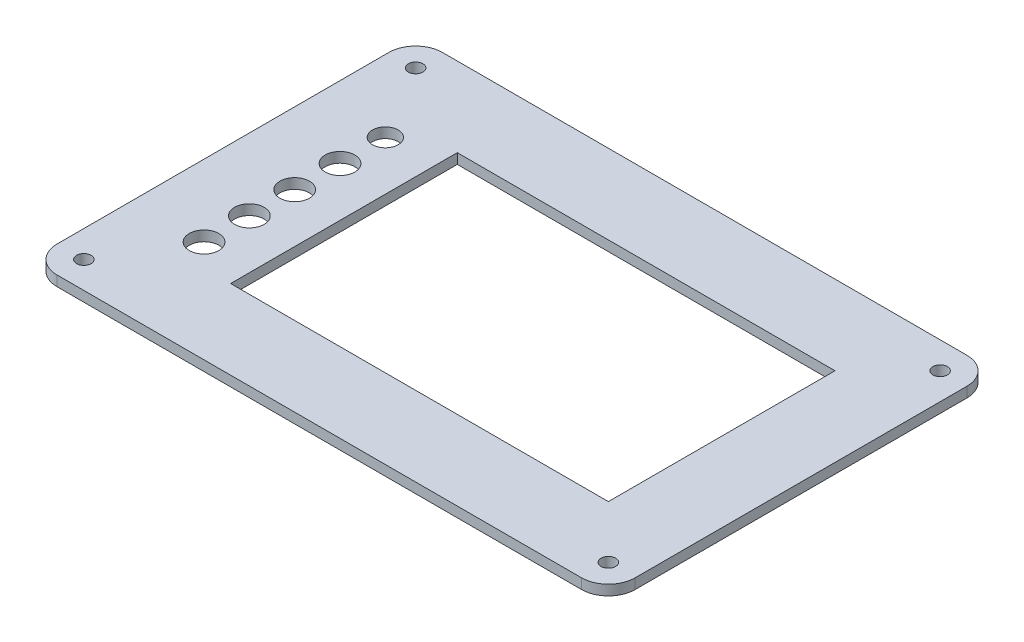
ISO-10303-21;
HEADER;
FILE_DESCRIPTION(('STEP AP214'),'2;1');
FILE_NAME('part.step','',(''),(''),'','','');
FILE_SCHEMA(('AUTOMOTIVE_DESIGN { 1 0 10303 214 1 1 1 1 }'));
ENDSEC;
DATA;
#1=APPLICATION_CONTEXT('core data for automotive mechanical design processes');
#2=APPLICATION_PROTOCOL_DEFINITION('international standard','automotive_design',2000,#1);
#3=PRODUCT_CONTEXT('',#1,'mechanical');
#4=PRODUCT('Part','Part','',(#3));
#5=PRODUCT_RELATED_PRODUCT_CATEGORY('part','',(#4));
#6=PRODUCT_DEFINITION_FORMATION('','',#4);
#7=PRODUCT_DEFINITION_CONTEXT('part definition',#1,'design');
#8=PRODUCT_DEFINITION('design','',#6,#7);
#9=PRODUCT_DEFINITION_SHAPE('','',#8);
#10=(LENGTH_UNIT() NAMED_UNIT(*) SI_UNIT(.MILLI.,.METRE.));
#11=(NAMED_UNIT(*) PLANE_ANGLE_UNIT() SI_UNIT($,.RADIAN.));
#12=(NAMED_UNIT(*) SI_UNIT($,.STERADIAN.) SOLID_ANGLE_UNIT());
#13=UNCERTAINTY_MEASURE_WITH_UNIT(LENGTH_MEASURE(1.E-05),#10,'distance_accuracy_value','');
#14=(GEOMETRIC_REPRESENTATION_CONTEXT(3) GLOBAL_UNCERTAINTY_ASSIGNED_CONTEXT((#13)) GLOBAL_UNIT_ASSIGNED_CONTEXT((#10,
#11,#12)) REPRESENTATION_CONTEXT('',''));
#15=CARTESIAN_POINT('',(0.,0.,0.));
#16=DIRECTION('',(0.,0.,1.));
#17=DIRECTION('',(1.,0.,0.));
#18=AXIS2_PLACEMENT_3D('',#15,#16,#17);
#19=CARTESIAN_POINT('',(-40.825,1.5875,-25.825));
#20=DIRECTION('',(0.,1.,0.));
#21=DIRECTION('',(0.,0.,1.));
#22=AXIS2_PLACEMENT_3D('',#19,#20,#21);
#23=PLANE('',#22);
#24=DIRECTION('',(0.,0.,-1.));
#25=VECTOR('',#24,1.);
#26=CARTESIAN_POINT('',(32.64,1.5875,-17.64));
#27=LINE('',#26,#25);
#28=CARTESIAN_POINT('',(32.64,1.5875,17.64));
#29=VERTEX_POINT('',#28);
#30=CARTESIAN_POINT('',(32.64,1.5875,-17.64));
#31=VERTEX_POINT('',#30);
#32=EDGE_CURVE('E56',#29,#31,#27,.T.);
#33=ORIENTED_EDGE('',*,*,#32,.F.);
#34=DIRECTION('',(1.,0.,0.));
#35=VECTOR('',#34,1.);
#36=CARTESIAN_POINT('',(-26.16,1.5875,17.64));
#37=LINE('',#36,#35);
#38=CARTESIAN_POINT('',(-26.16,1.5875,17.64));
#39=VERTEX_POINT('',#38);
#40=EDGE_CURVE('E148',#39,#29,#37,.T.);
#41=ORIENTED_EDGE('',*,*,#40,.F.);
#42=DIRECTION('',(0.,0.,1.));
#43=VECTOR('',#42,1.);
#44=CARTESIAN_POINT('',(-26.16,1.5875,-17.64));
#45=LINE('',#44,#43);
#46=CARTESIAN_POINT('',(-26.16,1.5875,-17.64));
#47=VERTEX_POINT('',#46);
#48=EDGE_CURVE('E152',#47,#39,#45,.T.);
#49=ORIENTED_EDGE('',*,*,#48,.F.);
#50=DIRECTION('',(-1.,0.,0.));
#51=VECTOR('',#50,1.);
#52=CARTESIAN_POINT('',(-26.16,1.5875,-17.64));
#53=LINE('',#52,#51);
#54=EDGE_CURVE('E192',#31,#47,#53,.T.);
#55=ORIENTED_EDGE('',*,*,#54,.F.);
#56=EDGE_LOOP('',(#33,#41,#49,#55));
#57=FACE_BOUND('',#56,.T.);
#58=CARTESIAN_POINT('',(-33.8249999999999,1.5875,14.115));
#59=DIRECTION('',(0.,1.,0.));
#60=DIRECTION('',(0.,0.,1.));
#61=AXIS2_PLACEMENT_3D('',#58,#59,#60);
#62=CIRCLE('',#61,2.30000000000001);
#63=CARTESIAN_POINT('',(-33.8249999999999,1.5875,16.415));
#64=VERTEX_POINT('',#63);
#65=EDGE_CURVE('E319',#64,#64,#62,.T.);
#66=ORIENTED_EDGE('',*,*,#65,.F.);
#67=EDGE_LOOP('',(#66));
#68=FACE_BOUND('',#67,.T.);
#69=CARTESIAN_POINT('',(-33.825,1.5875,7.059));
#70=DIRECTION('',(0.,1.,0.));
#71=DIRECTION('',(0.,0.,1.));
#72=AXIS2_PLACEMENT_3D('',#69,#70,#71);
#73=CIRCLE('',#72,2.30000000000001);
#74=CARTESIAN_POINT('',(-33.825,1.5875,9.35900000000001));
#75=VERTEX_POINT('',#74);
#76=EDGE_CURVE('E313',#75,#75,#73,.T.);
#77=ORIENTED_EDGE('',*,*,#76,.F.);
#78=EDGE_LOOP('',(#77));
#79=FACE_BOUND('',#78,.T.);
#80=CARTESIAN_POINT('',(-33.825,1.5875,0.00300000000000213));
#81=DIRECTION('',(0.,1.,0.));
#82=DIRECTION('',(0.,0.,1.));
#83=AXIS2_PLACEMENT_3D('',#80,#81,#82);
#84=CIRCLE('',#83,2.3);
#85=CARTESIAN_POINT('',(-33.825,1.5875,2.303));
#86=VERTEX_POINT('',#85);
#87=EDGE_CURVE('E307',#86,#86,#84,.T.);
#88=ORIENTED_EDGE('',*,*,#87,.F.);
#89=EDGE_LOOP('',(#88));
#90=FACE_BOUND('',#89,.T.);
#91=CARTESIAN_POINT('',(-33.825,1.5875,-7.053));
#92=DIRECTION('',(0.,1.,0.));
#93=DIRECTION('',(0.,0.,1.));
#94=AXIS2_PLACEMENT_3D('',#91,#92,#93);
#95=CIRCLE('',#94,2.3);
#96=CARTESIAN_POINT('',(-33.825,1.5875,-4.753));
#97=VERTEX_POINT('',#96);
#98=EDGE_CURVE('E301',#97,#97,#95,.T.);
#99=ORIENTED_EDGE('',*,*,#98,.F.);
#100=EDGE_LOOP('',(#99));
#101=FACE_BOUND('',#100,.T.);
#102=CARTESIAN_POINT('',(-33.825,1.5875,-14.109));
#103=DIRECTION('',(0.,1.,0.));
#104=DIRECTION('',(0.,0.,1.));
#105=AXIS2_PLACEMENT_3D('',#102,#103,#104);
#106=CIRCLE('',#105,1.9986);
#107=CARTESIAN_POINT('',(-33.825,1.5875,-12.1104));
#108=VERTEX_POINT('',#107);
#109=EDGE_CURVE('E295',#108,#108,#106,.T.);
#110=ORIENTED_EDGE('',*,*,#109,.F.);
#111=EDGE_LOOP('',(#110));
#112=FACE_BOUND('',#111,.T.);
#113=CARTESIAN_POINT('',(-40.825,1.5875,-25.825));
#114=DIRECTION('',(0.,1.,0.));
#115=DIRECTION('',(0.,0.,1.));
#116=AXIS2_PLACEMENT_3D('',#113,#114,#115);
#117=CIRCLE('',#116,1.1303);
#118=CARTESIAN_POINT('',(-40.825,1.5875,-24.6947));
#119=VERTEX_POINT('',#118);
#120=EDGE_CURVE('E277',#119,#119,#117,.T.);
#121=ORIENTED_EDGE('',*,*,#120,.F.);
#122=EDGE_LOOP('',(#121));
#123=FACE_BOUND('',#122,.T.);
#124=CARTESIAN_POINT('',(40.825,1.5875,-25.825));
#125=DIRECTION('',(0.,1.,0.));
#126=DIRECTION('',(0.,0.,1.));
#127=AXIS2_PLACEMENT_3D('',#124,#125,#126);
#128=CIRCLE('',#127,1.1303);
#129=CARTESIAN_POINT('',(40.825,1.5875,-24.6947));
#130=VERTEX_POINT('',#129);
#131=EDGE_CURVE('E269',#130,#130,#128,.T.);
#132=ORIENTED_EDGE('',*,*,#131,.F.);
#133=EDGE_LOOP('',(#132));
#134=FACE_BOUND('',#133,.T.);
#135=CARTESIAN_POINT('',(-40.825,1.5875,-25.825));
#136=DIRECTION('',(0.,1.,0.));
#137=DIRECTION('',(0.,0.,1.));
#138=AXIS2_PLACEMENT_3D('',#135,#136,#137);
#139=CIRCLE('',#138,4.17499999999999);
#140=CARTESIAN_POINT('',(-40.825,1.5875,-30.));
#141=VERTEX_POINT('',#140);
#142=CARTESIAN_POINT('',(-45.,1.5875,-25.825));
#143=VERTEX_POINT('',#142);
#144=EDGE_CURVE('E182',#141,#143,#139,.T.);
#145=ORIENTED_EDGE('',*,*,#144,.T.);
#146=DIRECTION('',(0.,0.,1.));
#147=VECTOR('',#146,1.);
#148=CARTESIAN_POINT('',(-45.,1.5875,-25.825));
#149=LINE('',#148,#147);
#150=CARTESIAN_POINT('',(-45.,1.5875,25.825));
#151=VERTEX_POINT('',#150);
#152=EDGE_CURVE('E261',#143,#151,#149,.T.);
#153=ORIENTED_EDGE('',*,*,#152,.T.);
#154=CARTESIAN_POINT('',(-40.825,1.5875,25.825));
#155=DIRECTION('',(0.,1.,0.));
#156=DIRECTION('',(0.,0.,1.));
#157=AXIS2_PLACEMENT_3D('',#154,#155,#156);
#158=CIRCLE('',#157,4.17500000000001);
#159=CARTESIAN_POINT('',(-40.825,1.5875,30.));
#160=VERTEX_POINT('',#159);
#161=EDGE_CURVE('E244',#151,#160,#158,.T.);
#162=ORIENTED_EDGE('',*,*,#161,.T.);
#163=DIRECTION('',(1.,0.,0.));
#164=VECTOR('',#163,1.);
#165=CARTESIAN_POINT('',(-40.825,1.5875,30.));
#166=LINE('',#165,#164);
#167=CARTESIAN_POINT('',(40.825,1.5875,30.));
#168=VERTEX_POINT('',#167);
#169=EDGE_CURVE('E260',#160,#168,#166,.T.);
#170=ORIENTED_EDGE('',*,*,#169,.T.);
#171=CARTESIAN_POINT('',(40.825,1.5875,25.825));
#172=DIRECTION('',(0.,1.,0.));
#173=DIRECTION('',(0.,0.,1.));
#174=AXIS2_PLACEMENT_3D('',#171,#172,#173);
#175=CIRCLE('',#174,4.17499999999999);
#176=CARTESIAN_POINT('',(45.,1.5875,25.825));
#177=VERTEX_POINT('',#176);
#178=EDGE_CURVE('E207',#168,#177,#175,.T.);
#179=ORIENTED_EDGE('',*,*,#178,.T.);
#180=DIRECTION('',(0.,0.,-1.));
#181=VECTOR('',#180,1.);
#182=CARTESIAN_POINT('',(45.,1.5875,-25.825));
#183=LINE('',#182,#181);
#184=CARTESIAN_POINT('',(45.,1.5875,-25.825));
#185=VERTEX_POINT('',#184);
#186=EDGE_CURVE('E201',#177,#185,#183,.T.);
#187=ORIENTED_EDGE('',*,*,#186,.T.);
#188=CARTESIAN_POINT('',(40.825,1.5875,-25.825));
#189=DIRECTION('',(0.,1.,0.));
#190=DIRECTION('',(0.,0.,1.));
#191=AXIS2_PLACEMENT_3D('',#188,#189,#190);
#192=CIRCLE('',#191,4.175);
#193=CARTESIAN_POINT('',(40.825,1.5875,-30.));
#194=VERTEX_POINT('',#193);
#195=EDGE_CURVE('E206',#185,#194,#192,.T.);
#196=ORIENTED_EDGE('',*,*,#195,.T.);
#197=DIRECTION('',(-1.,0.,0.));
#198=VECTOR('',#197,1.);
#199=CARTESIAN_POINT('',(-40.825,1.5875,-30.));
#200=LINE('',#199,#198);
#201=EDGE_CURVE('E209',#194,#141,#200,.T.);
#202=ORIENTED_EDGE('',*,*,#201,.T.);
#203=EDGE_LOOP('',(#145,#153,#162,#170,#179,#187,#196,#202));
#204=FACE_BOUND('',#203,.T.);
#205=CARTESIAN_POINT('',(40.825,1.5875,25.825));
#206=DIRECTION('',(0.,1.,0.));
#207=DIRECTION('',(0.,0.,1.));
#208=AXIS2_PLACEMENT_3D('',#205,#206,#207);
#209=CIRCLE('',#208,1.1303);
#210=CARTESIAN_POINT('',(40.825,1.5875,26.9553));
#211=VERTEX_POINT('',#210);
#212=EDGE_CURVE('E270',#211,#211,#209,.T.);
#213=ORIENTED_EDGE('',*,*,#212,.F.);
#214=EDGE_LOOP('',(#213));
#215=FACE_BOUND('',#214,.T.);
#216=CARTESIAN_POINT('',(-40.825,1.5875,25.825));
#217=DIRECTION('',(0.,1.,0.));
#218=DIRECTION('',(0.,0.,1.));
#219=AXIS2_PLACEMENT_3D('',#216,#217,#218);
#220=CIRCLE('',#219,1.1303);
#221=CARTESIAN_POINT('',(-40.825,1.5875,26.9553));
#222=VERTEX_POINT('',#221);
#223=EDGE_CURVE('E284',#222,#222,#220,.T.);
#224=ORIENTED_EDGE('',*,*,#223,.F.);
#225=EDGE_LOOP('',(#224));
#226=FACE_BOUND('',#225,.T.);
#227=ADVANCED_FACE('F41',(#57,#68,#79,#90,#101,#112,#123,#134,#204,#215,#226),#23,.T.);
#228=CARTESIAN_POINT('',(-40.825,0.,-25.825));
#229=DIRECTION('',(0.,1.,0.));
#230=DIRECTION('',(0.,0.,1.));
#231=AXIS2_PLACEMENT_3D('',#228,#229,#230);
#232=PLANE('',#231);
#233=DIRECTION('',(1.,0.,0.));
#234=VECTOR('',#233,1.);
#235=CARTESIAN_POINT('',(-26.16,0.,17.64));
#236=LINE('',#235,#234);
#237=CARTESIAN_POINT('',(-26.16,0.,17.64));
#238=VERTEX_POINT('',#237);
#239=CARTESIAN_POINT('',(32.64,0.,17.64));
#240=VERTEX_POINT('',#239);
#241=EDGE_CURVE('E138',#238,#240,#236,.T.);
#242=ORIENTED_EDGE('',*,*,#241,.T.);
#243=DIRECTION('',(0.,0.,-1.));
#244=VECTOR('',#243,1.);
#245=CARTESIAN_POINT('',(32.64,0.,-17.64));
#246=LINE('',#245,#244);
#247=CARTESIAN_POINT('',(32.64,0.,-17.64));
#248=VERTEX_POINT('',#247);
#249=EDGE_CURVE('E132',#240,#248,#246,.T.);
#250=ORIENTED_EDGE('',*,*,#249,.T.);
#251=DIRECTION('',(-1.,0.,0.));
#252=VECTOR('',#251,1.);
#253=CARTESIAN_POINT('',(-26.16,0.,-17.64));
#254=LINE('',#253,#252);
#255=CARTESIAN_POINT('',(-26.16,0.,-17.64));
#256=VERTEX_POINT('',#255);
#257=EDGE_CURVE('E141',#248,#256,#254,.T.);
#258=ORIENTED_EDGE('',*,*,#257,.T.);
#259=DIRECTION('',(0.,0.,1.));
#260=VECTOR('',#259,1.);
#261=CARTESIAN_POINT('',(-26.16,0.,-17.64));
#262=LINE('',#261,#260);
#263=EDGE_CURVE('E64',#256,#238,#262,.T.);
#264=ORIENTED_EDGE('',*,*,#263,.T.);
#265=EDGE_LOOP('',(#242,#250,#258,#264));
#266=FACE_BOUND('',#265,.T.);
#267=CARTESIAN_POINT('',(-33.8249999999999,0.,14.115));
#268=DIRECTION('',(0.,1.,0.));
#269=DIRECTION('',(0.,0.,1.));
#270=AXIS2_PLACEMENT_3D('',#267,#268,#269);
#271=CIRCLE('',#270,2.30000000000001);
#272=CARTESIAN_POINT('',(-33.8249999999999,0.,16.415));
#273=VERTEX_POINT('',#272);
#274=EDGE_CURVE('E316',#273,#273,#271,.T.);
#275=ORIENTED_EDGE('',*,*,#274,.T.);
#276=EDGE_LOOP('',(#275));
#277=FACE_BOUND('',#276,.T.);
#278=CARTESIAN_POINT('',(-33.825,0.,7.059));
#279=DIRECTION('',(0.,1.,0.));
#280=DIRECTION('',(0.,0.,1.));
#281=AXIS2_PLACEMENT_3D('',#278,#279,#280);
#282=CIRCLE('',#281,2.30000000000001);
#283=CARTESIAN_POINT('',(-33.825,0.,9.35900000000001));
#284=VERTEX_POINT('',#283);
#285=EDGE_CURVE('E310',#284,#284,#282,.T.);
#286=ORIENTED_EDGE('',*,*,#285,.T.);
#287=EDGE_LOOP('',(#286));
#288=FACE_BOUND('',#287,.T.);
#289=CARTESIAN_POINT('',(-33.825,0.,0.00300000000000213));
#290=DIRECTION('',(0.,1.,0.));
#291=DIRECTION('',(0.,0.,1.));
#292=AXIS2_PLACEMENT_3D('',#289,#290,#291);
#293=CIRCLE('',#292,2.3);
#294=CARTESIAN_POINT('',(-33.825,0.,2.303));
#295=VERTEX_POINT('',#294);
#296=EDGE_CURVE('E304',#295,#295,#293,.T.);
#297=ORIENTED_EDGE('',*,*,#296,.T.);
#298=EDGE_LOOP('',(#297));
#299=FACE_BOUND('',#298,.T.);
#300=CARTESIAN_POINT('',(-33.825,0.,-7.053));
#301=DIRECTION('',(0.,1.,0.));
#302=DIRECTION('',(0.,0.,1.));
#303=AXIS2_PLACEMENT_3D('',#300,#301,#302);
#304=CIRCLE('',#303,2.3);
#305=CARTESIAN_POINT('',(-33.825,0.,-4.753));
#306=VERTEX_POINT('',#305);
#307=EDGE_CURVE('E298',#306,#306,#304,.T.);
#308=ORIENTED_EDGE('',*,*,#307,.T.);
#309=EDGE_LOOP('',(#308));
#310=FACE_BOUND('',#309,.T.);
#311=CARTESIAN_POINT('',(-33.825,0.,-14.109));
#312=DIRECTION('',(0.,1.,0.));
#313=DIRECTION('',(0.,0.,1.));
#314=AXIS2_PLACEMENT_3D('',#311,#312,#313);
#315=CIRCLE('',#314,1.9986);
#316=CARTESIAN_POINT('',(-33.825,0.,-12.1104));
#317=VERTEX_POINT('',#316);
#318=EDGE_CURVE('E291',#317,#317,#315,.T.);
#319=ORIENTED_EDGE('',*,*,#318,.T.);
#320=EDGE_LOOP('',(#319));
#321=FACE_BOUND('',#320,.T.);
#322=CARTESIAN_POINT('',(-40.825,0.,-25.825));
#323=DIRECTION('',(0.,1.,0.));
#324=DIRECTION('',(0.,0.,1.));
#325=AXIS2_PLACEMENT_3D('',#322,#323,#324);
#326=CIRCLE('',#325,4.17499999999999);
#327=CARTESIAN_POINT('',(-40.825,0.,-30.));
#328=VERTEX_POINT('',#327);
#329=CARTESIAN_POINT('',(-45.,0.,-25.825));
#330=VERTEX_POINT('',#329);
#331=EDGE_CURVE('E168',#328,#330,#326,.T.);
#332=ORIENTED_EDGE('',*,*,#331,.F.);
#333=DIRECTION('',(-1.,0.,0.));
#334=VECTOR('',#333,1.);
#335=CARTESIAN_POINT('',(-40.825,0.,-30.));
#336=LINE('',#335,#334);
#337=CARTESIAN_POINT('',(40.825,0.,-30.));
#338=VERTEX_POINT('',#337);
#339=EDGE_CURVE('E179',#338,#328,#336,.T.);
#340=ORIENTED_EDGE('',*,*,#339,.F.);
#341=CARTESIAN_POINT('',(40.825,0.,-25.825));
#342=DIRECTION('',(0.,1.,0.));
#343=DIRECTION('',(0.,0.,1.));
#344=AXIS2_PLACEMENT_3D('',#341,#342,#343);
#345=CIRCLE('',#344,4.175);
#346=CARTESIAN_POINT('',(45.,0.,-25.825));
#347=VERTEX_POINT('',#346);
#348=EDGE_CURVE('E177',#347,#338,#345,.T.);
#349=ORIENTED_EDGE('',*,*,#348,.F.);
#350=DIRECTION('',(0.,0.,-1.));
#351=VECTOR('',#350,1.);
#352=CARTESIAN_POINT('',(45.,0.,-25.825));
#353=LINE('',#352,#351);
#354=CARTESIAN_POINT('',(45.,0.,25.825));
#355=VERTEX_POINT('',#354);
#356=EDGE_CURVE('E175',#355,#347,#353,.T.);
#357=ORIENTED_EDGE('',*,*,#356,.F.);
#358=CARTESIAN_POINT('',(40.825,0.,25.825));
#359=DIRECTION('',(0.,1.,0.));
#360=DIRECTION('',(0.,0.,1.));
#361=AXIS2_PLACEMENT_3D('',#358,#359,#360);
#362=CIRCLE('',#361,4.17499999999999);
#363=CARTESIAN_POINT('',(40.825,0.,30.));
#364=VERTEX_POINT('',#363);
#365=EDGE_CURVE('E173',#364,#355,#362,.T.);
#366=ORIENTED_EDGE('',*,*,#365,.F.);
#367=DIRECTION('',(1.,0.,0.));
#368=VECTOR('',#367,1.);
#369=CARTESIAN_POINT('',(-40.825,0.,30.));
#370=LINE('',#369,#368);
#371=CARTESIAN_POINT('',(-40.825,0.,30.));
#372=VERTEX_POINT('',#371);
#373=EDGE_CURVE('E171',#372,#364,#370,.T.);
#374=ORIENTED_EDGE('',*,*,#373,.F.);
#375=CARTESIAN_POINT('',(-40.825,0.,25.825));
#376=DIRECTION('',(0.,1.,0.));
#377=DIRECTION('',(0.,0.,1.));
#378=AXIS2_PLACEMENT_3D('',#375,#376,#377);
#379=CIRCLE('',#378,4.17500000000001);
#380=CARTESIAN_POINT('',(-45.,0.,25.825));
#381=VERTEX_POINT('',#380);
#382=EDGE_CURVE('E167',#381,#372,#379,.T.);
#383=ORIENTED_EDGE('',*,*,#382,.F.);
#384=DIRECTION('',(0.,0.,1.));
#385=VECTOR('',#384,1.);
#386=CARTESIAN_POINT('',(-45.,0.,-25.825));
#387=LINE('',#386,#385);
#388=EDGE_CURVE('E162',#330,#381,#387,.T.);
#389=ORIENTED_EDGE('',*,*,#388,.F.);
#390=EDGE_LOOP('',(#332,#340,#349,#357,#366,#374,#383,#389));
#391=FACE_BOUND('',#390,.T.);
#392=CARTESIAN_POINT('',(40.825,0.,-25.825));
#393=DIRECTION('',(0.,1.,0.));
#394=DIRECTION('',(0.,0.,1.));
#395=AXIS2_PLACEMENT_3D('',#392,#393,#394);
#396=CIRCLE('',#395,1.1303);
#397=CARTESIAN_POINT('',(40.825,0.,-24.6947));
#398=VERTEX_POINT('',#397);
#399=EDGE_CURVE('E266',#398,#398,#396,.T.);
#400=ORIENTED_EDGE('',*,*,#399,.T.);
#401=EDGE_LOOP('',(#400));
#402=FACE_BOUND('',#401,.T.);
#403=CARTESIAN_POINT('',(40.825,0.,25.825));
#404=DIRECTION('',(0.,1.,0.));
#405=DIRECTION('',(0.,0.,1.));
#406=AXIS2_PLACEMENT_3D('',#403,#404,#405);
#407=CIRCLE('',#406,1.1303);
#408=CARTESIAN_POINT('',(40.825,0.,26.9553));
#409=VERTEX_POINT('',#408);
#410=EDGE_CURVE('E274',#409,#409,#407,.T.);
#411=ORIENTED_EDGE('',*,*,#410,.T.);
#412=EDGE_LOOP('',(#411));
#413=FACE_BOUND('',#412,.T.);
#414=CARTESIAN_POINT('',(-40.825,0.,-25.825));
#415=DIRECTION('',(0.,1.,0.));
#416=DIRECTION('',(0.,0.,1.));
#417=AXIS2_PLACEMENT_3D('',#414,#415,#416);
#418=CIRCLE('',#417,1.1303);
#419=CARTESIAN_POINT('',(-40.825,0.,-24.6947));
#420=VERTEX_POINT('',#419);
#421=EDGE_CURVE('E281',#420,#420,#418,.T.);
#422=ORIENTED_EDGE('',*,*,#421,.T.);
#423=EDGE_LOOP('',(#422));
#424=FACE_BOUND('',#423,.T.);
#425=CARTESIAN_POINT('',(-40.825,0.,25.825));
#426=DIRECTION('',(0.,1.,0.));
#427=DIRECTION('',(0.,0.,1.));
#428=AXIS2_PLACEMENT_3D('',#425,#426,#427);
#429=CIRCLE('',#428,1.1303);
#430=CARTESIAN_POINT('',(-40.825,0.,26.9553));
#431=VERTEX_POINT('',#430);
#432=EDGE_CURVE('E288',#431,#431,#429,.T.);
#433=ORIENTED_EDGE('',*,*,#432,.T.);
#434=EDGE_LOOP('',(#433));
#435=FACE_BOUND('',#434,.T.);
#436=ADVANCED_FACE('F145',(#266,#277,#288,#299,#310,#321,#391,#402,#413,#424,#435),#232,.F.);
#437=CARTESIAN_POINT('',(-40.825,1.5875,-25.825));
#438=DIRECTION('',(0.,-1.,0.));
#439=DIRECTION('',(0.,0.,-1.));
#440=AXIS2_PLACEMENT_3D('',#437,#438,#439);
#441=CYLINDRICAL_SURFACE('',#440,4.17499999999999);
#442=ORIENTED_EDGE('',*,*,#331,.T.);
#443=DIRECTION('',(0.,-1.,0.));
#444=VECTOR('',#443,1.);
#445=CARTESIAN_POINT('',(-45.,1.5875,-25.825));
#446=LINE('',#445,#444);
#447=EDGE_CURVE('E12',#143,#330,#446,.T.);
#448=ORIENTED_EDGE('',*,*,#447,.F.);
#449=ORIENTED_EDGE('',*,*,#144,.F.);
#450=DIRECTION('',(0.,-1.,0.));
#451=VECTOR('',#450,1.);
#452=CARTESIAN_POINT('',(-40.825,1.5875,-30.));
#453=LINE('',#452,#451);
#454=EDGE_CURVE('E183',#141,#328,#453,.T.);
#455=ORIENTED_EDGE('',*,*,#454,.T.);
#456=EDGE_LOOP('',(#442,#448,#449,#455));
#457=FACE_BOUND('',#456,.T.);
#458=ADVANCED_FACE('F43',(#457),#441,.T.);
#459=CARTESIAN_POINT('',(-45.,1.5875,-25.825));
#460=DIRECTION('',(1.,0.,0.));
#461=DIRECTION('',(0.,0.,-1.));
#462=AXIS2_PLACEMENT_3D('',#459,#460,#461);
#463=PLANE('',#462);
#464=ORIENTED_EDGE('',*,*,#388,.T.);
#465=DIRECTION('',(0.,-1.,0.));
#466=VECTOR('',#465,1.);
#467=CARTESIAN_POINT('',(-45.,1.5875,25.825));
#468=LINE('',#467,#466);
#469=EDGE_CURVE('E49',#151,#381,#468,.T.);
#470=ORIENTED_EDGE('',*,*,#469,.F.);
#471=ORIENTED_EDGE('',*,*,#152,.F.);
#472=ORIENTED_EDGE('',*,*,#447,.T.);
#473=EDGE_LOOP('',(#464,#470,#471,#472));
#474=FACE_BOUND('',#473,.T.);
#475=ADVANCED_FACE('F366',(#474),#463,.F.);
#476=CARTESIAN_POINT('',(-40.825,1.5875,25.825));
#477=DIRECTION('',(0.,-1.,0.));
#478=DIRECTION('',(0.,0.,-1.));
#479=AXIS2_PLACEMENT_3D('',#476,#477,#478);
#480=CYLINDRICAL_SURFACE('',#479,4.17500000000001);
#481=ORIENTED_EDGE('',*,*,#382,.T.);
#482=DIRECTION('',(0.,-1.,0.));
#483=VECTOR('',#482,1.);
#484=CARTESIAN_POINT('',(-40.825,1.5875,30.));
#485=LINE('',#484,#483);
#486=EDGE_CURVE('E235',#160,#372,#485,.T.);
#487=ORIENTED_EDGE('',*,*,#486,.F.);
#488=ORIENTED_EDGE('',*,*,#161,.F.);
#489=ORIENTED_EDGE('',*,*,#469,.T.);
#490=EDGE_LOOP('',(#481,#487,#488,#489));
#491=FACE_BOUND('',#490,.T.);
#492=ADVANCED_FACE('F242',(#491),#480,.T.);
#493=CARTESIAN_POINT('',(-40.825,1.5875,30.));
#494=DIRECTION('',(0.,0.,-1.));
#495=DIRECTION('',(-1.,0.,0.));
#496=AXIS2_PLACEMENT_3D('',#493,#494,#495);
#497=PLANE('',#496);
#498=ORIENTED_EDGE('',*,*,#373,.T.);
#499=DIRECTION('',(0.,-1.,0.));
#500=VECTOR('',#499,1.);
#501=CARTESIAN_POINT('',(40.825,1.5875,30.));
#502=LINE('',#501,#500);
#503=EDGE_CURVE('E232',#168,#364,#502,.T.);
#504=ORIENTED_EDGE('',*,*,#503,.F.);
#505=ORIENTED_EDGE('',*,*,#169,.F.);
#506=ORIENTED_EDGE('',*,*,#486,.T.);
#507=EDGE_LOOP('',(#498,#504,#505,#506));
#508=FACE_BOUND('',#507,.T.);
#509=ADVANCED_FACE('F253',(#508),#497,.F.);
#510=CARTESIAN_POINT('',(40.825,1.5875,25.825));
#511=DIRECTION('',(0.,-1.,0.));
#512=DIRECTION('',(0.,0.,-1.));
#513=AXIS2_PLACEMENT_3D('',#510,#511,#512);
#514=CYLINDRICAL_SURFACE('',#513,4.17499999999999);
#515=ORIENTED_EDGE('',*,*,#365,.T.);
#516=DIRECTION('',(0.,-1.,0.));
#517=VECTOR('',#516,1.);
#518=CARTESIAN_POINT('',(45.,1.5875,25.825));
#519=LINE('',#518,#517);
#520=EDGE_CURVE('E227',#177,#355,#519,.T.);
#521=ORIENTED_EDGE('',*,*,#520,.F.);
#522=ORIENTED_EDGE('',*,*,#178,.F.);
#523=ORIENTED_EDGE('',*,*,#503,.T.);
#524=EDGE_LOOP('',(#515,#521,#522,#523));
#525=FACE_BOUND('',#524,.T.);
#526=ADVANCED_FACE('F257',(#525),#514,.T.);
#527=CARTESIAN_POINT('',(45.,1.5875,-25.825));
#528=DIRECTION('',(-1.,0.,0.));
#529=DIRECTION('',(0.,0.,1.));
#530=AXIS2_PLACEMENT_3D('',#527,#528,#529);
#531=PLANE('',#530);
#532=ORIENTED_EDGE('',*,*,#356,.T.);
#533=DIRECTION('',(0.,-1.,0.));
#534=VECTOR('',#533,1.);
#535=CARTESIAN_POINT('',(45.,1.5875,-25.825));
#536=LINE('',#535,#534);
#537=EDGE_CURVE('E222',#185,#347,#536,.T.);
#538=ORIENTED_EDGE('',*,*,#537,.F.);
#539=ORIENTED_EDGE('',*,*,#186,.F.);
#540=ORIENTED_EDGE('',*,*,#520,.T.);
#541=EDGE_LOOP('',(#532,#538,#539,#540));
#542=FACE_BOUND('',#541,.T.);
#543=ADVANCED_FACE('F356',(#542),#531,.F.);
#544=CARTESIAN_POINT('',(40.825,1.5875,-25.825));
#545=DIRECTION('',(0.,-1.,0.));
#546=DIRECTION('',(0.,0.,-1.));
#547=AXIS2_PLACEMENT_3D('',#544,#545,#546);
#548=CYLINDRICAL_SURFACE('',#547,4.175);
#549=ORIENTED_EDGE('',*,*,#348,.T.);
#550=DIRECTION('',(0.,-1.,0.));
#551=VECTOR('',#550,1.);
#552=CARTESIAN_POINT('',(40.825,1.5875,-30.));
#553=LINE('',#552,#551);
#554=EDGE_CURVE('E216',#194,#338,#553,.T.);
#555=ORIENTED_EDGE('',*,*,#554,.F.);
#556=ORIENTED_EDGE('',*,*,#195,.F.);
#557=ORIENTED_EDGE('',*,*,#537,.T.);
#558=EDGE_LOOP('',(#549,#555,#556,#557));
#559=FACE_BOUND('',#558,.T.);
#560=ADVANCED_FACE('F353',(#559),#548,.T.);
#561=CARTESIAN_POINT('',(-40.825,1.5875,-30.));
#562=DIRECTION('',(0.,0.,1.));
#563=DIRECTION('',(1.,0.,0.));
#564=AXIS2_PLACEMENT_3D('',#561,#562,#563);
#565=PLANE('',#564);
#566=ORIENTED_EDGE('',*,*,#339,.T.);
#567=ORIENTED_EDGE('',*,*,#454,.F.);
#568=ORIENTED_EDGE('',*,*,#201,.F.);
#569=ORIENTED_EDGE('',*,*,#554,.T.);
#570=EDGE_LOOP('',(#566,#567,#568,#569));
#571=FACE_BOUND('',#570,.T.);
#572=ADVANCED_FACE('F350',(#571),#565,.F.);
#573=CARTESIAN_POINT('',(40.825,1.5875,-25.825));
#574=DIRECTION('',(0.,-1.,0.));
#575=DIRECTION('',(0.,0.,-1.));
#576=AXIS2_PLACEMENT_3D('',#573,#574,#575);
#577=CYLINDRICAL_SURFACE('',#576,1.1303);
#578=ORIENTED_EDGE('',*,*,#131,.T.);
#579=EDGE_LOOP('',(#578));
#580=FACE_BOUND('',#579,.T.);
#581=ORIENTED_EDGE('',*,*,#399,.F.);
#582=EDGE_LOOP('',(#581));
#583=FACE_BOUND('',#582,.T.);
#584=ADVANCED_FACE('F347',(#580,#583),#577,.F.);
#585=CARTESIAN_POINT('',(40.825,1.5875,25.825));
#586=DIRECTION('',(0.,-1.,0.));
#587=DIRECTION('',(0.,0.,-1.));
#588=AXIS2_PLACEMENT_3D('',#585,#586,#587);
#589=CYLINDRICAL_SURFACE('',#588,1.1303);
#590=ORIENTED_EDGE('',*,*,#212,.T.);
#591=EDGE_LOOP('',(#590));
#592=FACE_BOUND('',#591,.T.);
#593=ORIENTED_EDGE('',*,*,#410,.F.);
#594=EDGE_LOOP('',(#593));
#595=FACE_BOUND('',#594,.T.);
#596=ADVANCED_FACE('F393',(#592,#595),#589,.F.);
#597=CARTESIAN_POINT('',(-40.825,1.5875,-25.825));
#598=DIRECTION('',(0.,-1.,0.));
#599=DIRECTION('',(0.,0.,-1.));
#600=AXIS2_PLACEMENT_3D('',#597,#598,#599);
#601=CYLINDRICAL_SURFACE('',#600,1.1303);
#602=ORIENTED_EDGE('',*,*,#120,.T.);
#603=EDGE_LOOP('',(#602));
#604=FACE_BOUND('',#603,.T.);
#605=ORIENTED_EDGE('',*,*,#421,.F.);
#606=EDGE_LOOP('',(#605));
#607=FACE_BOUND('',#606,.T.);
#608=ADVANCED_FACE('F382',(#604,#607),#601,.F.);
#609=CARTESIAN_POINT('',(-40.825,1.5875,25.825));
#610=DIRECTION('',(0.,-1.,0.));
#611=DIRECTION('',(0.,0.,-1.));
#612=AXIS2_PLACEMENT_3D('',#609,#610,#611);
#613=CYLINDRICAL_SURFACE('',#612,1.1303);
#614=ORIENTED_EDGE('',*,*,#223,.T.);
#615=EDGE_LOOP('',(#614));
#616=FACE_BOUND('',#615,.T.);
#617=ORIENTED_EDGE('',*,*,#432,.F.);
#618=EDGE_LOOP('',(#617));
#619=FACE_BOUND('',#618,.T.);
#620=ADVANCED_FACE('F378',(#616,#619),#613,.F.);
#621=CARTESIAN_POINT('',(-33.825,0.,-14.109));
#622=DIRECTION('',(0.,1.,0.));
#623=DIRECTION('',(0.,0.,1.));
#624=AXIS2_PLACEMENT_3D('',#621,#622,#623);
#625=CYLINDRICAL_SURFACE('',#624,1.9986);
#626=ORIENTED_EDGE('',*,*,#318,.F.);
#627=EDGE_LOOP('',(#626));
#628=FACE_BOUND('',#627,.T.);
#629=ORIENTED_EDGE('',*,*,#109,.T.);
#630=EDGE_LOOP('',(#629));
#631=FACE_BOUND('',#630,.T.);
#632=ADVANCED_FACE('F381',(#628,#631),#625,.F.);
#633=CARTESIAN_POINT('',(-33.825,0.,-7.053));
#634=DIRECTION('',(0.,1.,0.));
#635=DIRECTION('',(0.,0.,1.));
#636=AXIS2_PLACEMENT_3D('',#633,#634,#635);
#637=CYLINDRICAL_SURFACE('',#636,2.3);
#638=ORIENTED_EDGE('',*,*,#307,.F.);
#639=EDGE_LOOP('',(#638));
#640=FACE_BOUND('',#639,.T.);
#641=ORIENTED_EDGE('',*,*,#98,.T.);
#642=EDGE_LOOP('',(#641));
#643=FACE_BOUND('',#642,.T.);
#644=ADVANCED_FACE('F390',(#640,#643),#637,.F.);
#645=CARTESIAN_POINT('',(-33.825,0.,0.00300000000000213));
#646=DIRECTION('',(0.,1.,0.));
#647=DIRECTION('',(0.,0.,1.));
#648=AXIS2_PLACEMENT_3D('',#645,#646,#647);
#649=CYLINDRICAL_SURFACE('',#648,2.3);
#650=ORIENTED_EDGE('',*,*,#296,.F.);
#651=EDGE_LOOP('',(#650));
#652=FACE_BOUND('',#651,.T.);
#653=ORIENTED_EDGE('',*,*,#87,.T.);
#654=EDGE_LOOP('',(#653));
#655=FACE_BOUND('',#654,.T.);
#656=ADVANCED_FACE('F498',(#652,#655),#649,.F.);
#657=CARTESIAN_POINT('',(-33.825,0.,7.059));
#658=DIRECTION('',(0.,1.,0.));
#659=DIRECTION('',(0.,0.,1.));
#660=AXIS2_PLACEMENT_3D('',#657,#658,#659);
#661=CYLINDRICAL_SURFACE('',#660,2.30000000000001);
#662=ORIENTED_EDGE('',*,*,#285,.F.);
#663=EDGE_LOOP('',(#662));
#664=FACE_BOUND('',#663,.T.);
#665=ORIENTED_EDGE('',*,*,#76,.T.);
#666=EDGE_LOOP('',(#665));
#667=FACE_BOUND('',#666,.T.);
#668=ADVANCED_FACE('F492',(#664,#667),#661,.F.);
#669=CARTESIAN_POINT('',(-33.8249999999999,0.,14.115));
#670=DIRECTION('',(0.,1.,0.));
#671=DIRECTION('',(0.,0.,1.));
#672=AXIS2_PLACEMENT_3D('',#669,#670,#671);
#673=CYLINDRICAL_SURFACE('',#672,2.30000000000001);
#674=ORIENTED_EDGE('',*,*,#274,.F.);
#675=EDGE_LOOP('',(#674));
#676=FACE_BOUND('',#675,.T.);
#677=ORIENTED_EDGE('',*,*,#65,.T.);
#678=EDGE_LOOP('',(#677));
#679=FACE_BOUND('',#678,.T.);
#680=ADVANCED_FACE('F467',(#676,#679),#673,.F.);
#681=CARTESIAN_POINT('',(32.64,0.,-17.64));
#682=DIRECTION('',(1.,0.,0.));
#683=DIRECTION('',(0.,0.,-1.));
#684=AXIS2_PLACEMENT_3D('',#681,#682,#683);
#685=PLANE('',#684);
#686=ORIENTED_EDGE('',*,*,#32,.T.);
#687=DIRECTION('',(0.,1.,0.));
#688=VECTOR('',#687,1.);
#689=CARTESIAN_POINT('',(32.64,0.,-17.64));
#690=LINE('',#689,#688);
#691=EDGE_CURVE('E128',#248,#31,#690,.T.);
#692=ORIENTED_EDGE('',*,*,#691,.F.);
#693=ORIENTED_EDGE('',*,*,#249,.F.);
#694=DIRECTION('',(0.,1.,0.));
#695=VECTOR('',#694,1.);
#696=CARTESIAN_POINT('',(32.64,0.,17.64));
#697=LINE('',#696,#695);
#698=EDGE_CURVE('E198',#240,#29,#697,.T.);
#699=ORIENTED_EDGE('',*,*,#698,.T.);
#700=EDGE_LOOP('',(#686,#692,#693,#699));
#701=FACE_BOUND('',#700,.T.);
#702=ADVANCED_FACE('F130',(#701),#685,.F.);
#703=CARTESIAN_POINT('',(-26.16,0.,17.64));
#704=DIRECTION('',(0.,0.,1.));
#705=DIRECTION('',(1.,0.,0.));
#706=AXIS2_PLACEMENT_3D('',#703,#704,#705);
#707=PLANE('',#706);
#708=ORIENTED_EDGE('',*,*,#40,.T.);
#709=ORIENTED_EDGE('',*,*,#698,.F.);
#710=ORIENTED_EDGE('',*,*,#241,.F.);
#711=DIRECTION('',(0.,1.,0.));
#712=VECTOR('',#711,1.);
#713=CARTESIAN_POINT('',(-26.16,0.,17.64));
#714=LINE('',#713,#712);
#715=EDGE_CURVE('E324',#238,#39,#714,.T.);
#716=ORIENTED_EDGE('',*,*,#715,.T.);
#717=EDGE_LOOP('',(#708,#709,#710,#716));
#718=FACE_BOUND('',#717,.T.);
#719=ADVANCED_FACE('F327',(#718),#707,.F.);
#720=CARTESIAN_POINT('',(-26.16,0.,-17.64));
#721=DIRECTION('',(-1.,0.,0.));
#722=DIRECTION('',(0.,0.,1.));
#723=AXIS2_PLACEMENT_3D('',#720,#721,#722);
#724=PLANE('',#723);
#725=ORIENTED_EDGE('',*,*,#48,.T.);
#726=ORIENTED_EDGE('',*,*,#715,.F.);
#727=ORIENTED_EDGE('',*,*,#263,.F.);
#728=DIRECTION('',(0.,1.,0.));
#729=VECTOR('',#728,1.);
#730=CARTESIAN_POINT('',(-26.16,0.,-17.64));
#731=LINE('',#730,#729);
#732=EDGE_CURVE('E137',#256,#47,#731,.T.);
#733=ORIENTED_EDGE('',*,*,#732,.T.);
#734=EDGE_LOOP('',(#725,#726,#727,#733));
#735=FACE_BOUND('',#734,.T.);
#736=ADVANCED_FACE('F331',(#735),#724,.F.);
#737=CARTESIAN_POINT('',(-26.16,0.,-17.64));
#738=DIRECTION('',(0.,0.,-1.));
#739=DIRECTION('',(-1.,0.,0.));
#740=AXIS2_PLACEMENT_3D('',#737,#738,#739);
#741=PLANE('',#740);
#742=ORIENTED_EDGE('',*,*,#54,.T.);
#743=ORIENTED_EDGE('',*,*,#732,.F.);
#744=ORIENTED_EDGE('',*,*,#257,.F.);
#745=ORIENTED_EDGE('',*,*,#691,.T.);
#746=EDGE_LOOP('',(#742,#743,#744,#745));
#747=FACE_BOUND('',#746,.T.);
#748=ADVANCED_FACE('F142',(#747),#741,.F.);
#749=CLOSED_SHELL('',(#227,#436,#458,#475,#492,#509,#526,#543,#560,#572,#584,#596,#608,#620,
#632,#644,#656,#668,#680,#702,#719,#736,#748));
#750=MANIFOLD_SOLID_BREP('B2',#749);
#751=ADVANCED_BREP_SHAPE_REPRESENTATION('',(#18,#750),#14);
#752=SHAPE_DEFINITION_REPRESENTATION(#9,#751);
ENDSEC;
END-ISO-10303-21;
